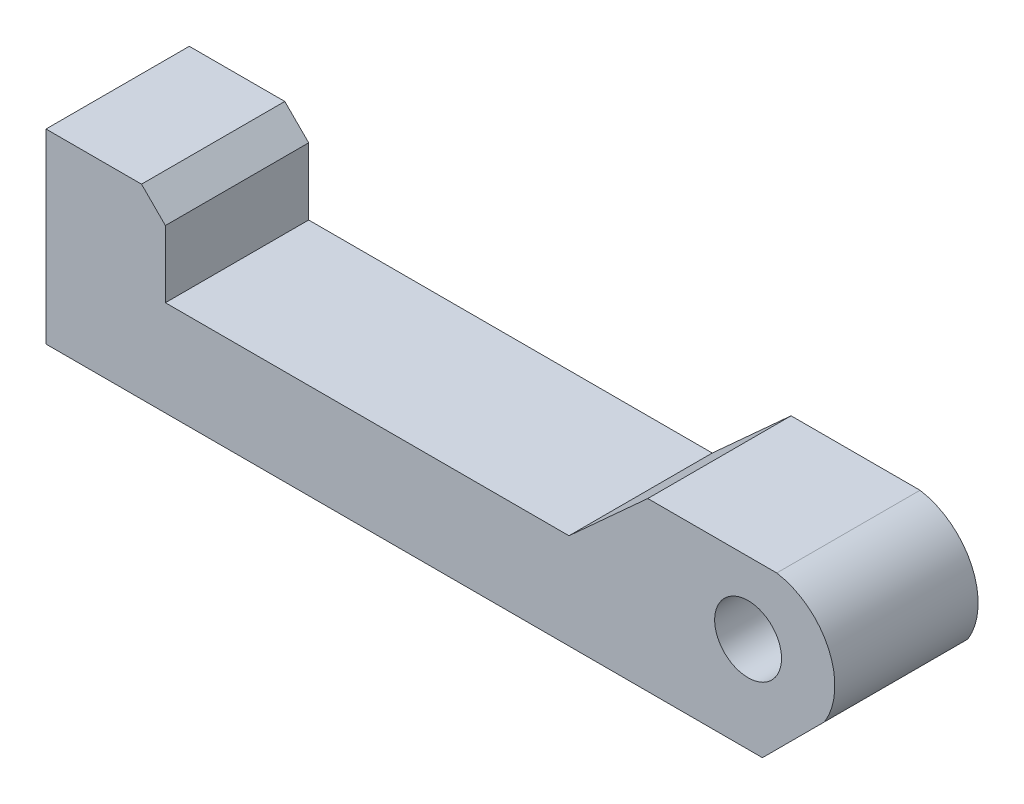
ISO-10303-21;
HEADER;
FILE_DESCRIPTION(('STEP AP214'),'2;1');
FILE_NAME('part.step','',(''),(''),'','','');
FILE_SCHEMA(('AUTOMOTIVE_DESIGN { 1 0 10303 214 1 1 1 1 }'));
ENDSEC;
DATA;
#1=APPLICATION_CONTEXT('core data for automotive mechanical design processes');
#2=APPLICATION_PROTOCOL_DEFINITION('international standard','automotive_design',2000,#1);
#3=PRODUCT_CONTEXT('',#1,'mechanical');
#4=PRODUCT('Part','Part','',(#3));
#5=PRODUCT_RELATED_PRODUCT_CATEGORY('part','',(#4));
#6=PRODUCT_DEFINITION_FORMATION('','',#4);
#7=PRODUCT_DEFINITION_CONTEXT('part definition',#1,'design');
#8=PRODUCT_DEFINITION('design','',#6,#7);
#9=PRODUCT_DEFINITION_SHAPE('','',#8);
#10=(LENGTH_UNIT() NAMED_UNIT(*) SI_UNIT(.MILLI.,.METRE.));
#11=(NAMED_UNIT(*) PLANE_ANGLE_UNIT() SI_UNIT($,.RADIAN.));
#12=(NAMED_UNIT(*) SI_UNIT($,.STERADIAN.) SOLID_ANGLE_UNIT());
#13=UNCERTAINTY_MEASURE_WITH_UNIT(LENGTH_MEASURE(1.E-05),#10,'distance_accuracy_value','');
#14=(GEOMETRIC_REPRESENTATION_CONTEXT(3) GLOBAL_UNCERTAINTY_ASSIGNED_CONTEXT((#13)) GLOBAL_UNIT_ASSIGNED_CONTEXT((#10,
#11,#12)) REPRESENTATION_CONTEXT('',''));
#15=CARTESIAN_POINT('',(0.,0.,0.));
#16=DIRECTION('',(0.,0.,1.));
#17=DIRECTION('',(1.,0.,0.));
#18=AXIS2_PLACEMENT_3D('',#15,#16,#17);
#19=CARTESIAN_POINT('',(0.,2.,0.));
#20=DIRECTION('',(0.,-1.,0.));
#21=DIRECTION('',(0.,0.,-1.));
#22=AXIS2_PLACEMENT_3D('',#19,#20,#21);
#23=PLANE('',#22);
#24=DIRECTION('',(0.,0.,-1.));
#25=VECTOR('',#24,1.);
#26=CARTESIAN_POINT('',(-5.65,2.,1.5));
#27=LINE('',#26,#25);
#28=CARTESIAN_POINT('',(-5.65,2.,1.5));
#29=VERTEX_POINT('',#28);
#30=CARTESIAN_POINT('',(-5.65,2.,-1.5));
#31=VERTEX_POINT('',#30);
#32=EDGE_CURVE('E222',#29,#31,#27,.T.);
#33=ORIENTED_EDGE('',*,*,#32,.F.);
#34=DIRECTION('',(1.,0.,0.));
#35=VECTOR('',#34,1.);
#36=CARTESIAN_POINT('',(-8.15,2.,1.5));
#37=LINE('',#36,#35);
#38=CARTESIAN_POINT('',(2.8,2.,1.5));
#39=VERTEX_POINT('',#38);
#40=EDGE_CURVE('E179',#29,#39,#37,.T.);
#41=ORIENTED_EDGE('',*,*,#40,.T.);
#42=DIRECTION('',(0.,0.,1.));
#43=VECTOR('',#42,1.);
#44=CARTESIAN_POINT('',(2.8,2.,-3.72991031209778));
#45=LINE('',#44,#43);
#46=CARTESIAN_POINT('',(2.8,2.,-1.5));
#47=VERTEX_POINT('',#46);
#48=EDGE_CURVE('E158',#47,#39,#45,.T.);
#49=ORIENTED_EDGE('',*,*,#48,.F.);
#50=DIRECTION('',(-1.,0.,0.));
#51=VECTOR('',#50,1.);
#52=CARTESIAN_POINT('',(-8.15,2.,-1.5));
#53=LINE('',#52,#51);
#54=EDGE_CURVE('E176',#47,#31,#53,.T.);
#55=ORIENTED_EDGE('',*,*,#54,.T.);
#56=EDGE_LOOP('',(#33,#41,#49,#55));
#57=FACE_BOUND('',#56,.T.);
#58=ADVANCED_FACE('F39',(#57),#23,.F.);
#59=CARTESIAN_POINT('',(-8.15,2.,-1.5));
#60=DIRECTION('',(0.,0.,1.));
#61=DIRECTION('',(1.,0.,0.));
#62=AXIS2_PLACEMENT_3D('',#59,#60,#61);
#63=PLANE('',#62);
#64=CARTESIAN_POINT('',(6.90991581729342,2.06359809876974,-1.5));
#65=DIRECTION('',(0.,0.,-1.));
#66=DIRECTION('',(1.,0.,0.));
#67=AXIS2_PLACEMENT_3D('',#64,#65,#66);
#68=CIRCLE('',#67,1.45632786028552);
#69=CARTESIAN_POINT('',(7.15,3.5,-1.5));
#70=VERTEX_POINT('',#69);
#71=CARTESIAN_POINT('',(8.15,1.3,-1.5));
#72=VERTEX_POINT('',#71);
#73=EDGE_CURVE('E120',#70,#72,#68,.T.);
#74=ORIENTED_EDGE('',*,*,#73,.T.);
#75=DIRECTION('',(0.707106781186548,0.707106781186548,0.));
#76=VECTOR('',#75,1.);
#77=CARTESIAN_POINT('',(6.85,0.,-1.5));
#78=LINE('',#77,#76);
#79=CARTESIAN_POINT('',(6.85,0.,-1.5));
#80=VERTEX_POINT('',#79);
#81=EDGE_CURVE('E133',#80,#72,#78,.T.);
#82=ORIENTED_EDGE('',*,*,#81,.F.);
#83=DIRECTION('',(-1.,0.,0.));
#84=VECTOR('',#83,1.);
#85=CARTESIAN_POINT('',(-8.15,0.,-1.5));
#86=LINE('',#85,#84);
#87=CARTESIAN_POINT('',(-8.15,0.,-1.5));
#88=VERTEX_POINT('',#87);
#89=EDGE_CURVE('E175',#80,#88,#86,.T.);
#90=ORIENTED_EDGE('',*,*,#89,.T.);
#91=DIRECTION('',(0.,-1.,0.));
#92=VECTOR('',#91,1.);
#93=CARTESIAN_POINT('',(-8.15,2.,-1.5));
#94=LINE('',#93,#92);
#95=CARTESIAN_POINT('',(-8.15,3.9,-1.5));
#96=VERTEX_POINT('',#95);
#97=EDGE_CURVE('E48',#96,#88,#94,.T.);
#98=ORIENTED_EDGE('',*,*,#97,.F.);
#99=DIRECTION('',(-1.,0.,0.));
#100=VECTOR('',#99,1.);
#101=CARTESIAN_POINT('',(-8.15,3.9,-1.5));
#102=LINE('',#101,#100);
#103=CARTESIAN_POINT('',(-6.15,3.9,-1.5));
#104=VERTEX_POINT('',#103);
#105=EDGE_CURVE('E218',#104,#96,#102,.T.);
#106=ORIENTED_EDGE('',*,*,#105,.F.);
#107=DIRECTION('',(0.707106781186548,-0.707106781186547,0.));
#108=VECTOR('',#107,1.);
#109=CARTESIAN_POINT('',(-5.65,3.4,-1.5));
#110=LINE('',#109,#108);
#111=CARTESIAN_POINT('',(-5.65,3.4,-1.5));
#112=VERTEX_POINT('',#111);
#113=EDGE_CURVE('E55',#104,#112,#110,.T.);
#114=ORIENTED_EDGE('',*,*,#113,.T.);
#115=DIRECTION('',(0.,-1.,0.));
#116=VECTOR('',#115,1.);
#117=CARTESIAN_POINT('',(-5.65,3.9,-1.5));
#118=LINE('',#117,#116);
#119=EDGE_CURVE('E62',#112,#31,#118,.T.);
#120=ORIENTED_EDGE('',*,*,#119,.T.);
#121=ORIENTED_EDGE('',*,*,#54,.F.);
#122=DIRECTION('',(0.739940073395944,0.672672793996313,0.));
#123=VECTOR('',#122,1.);
#124=CARTESIAN_POINT('',(4.45,3.5,-1.5));
#125=LINE('',#124,#123);
#126=CARTESIAN_POINT('',(4.45,3.5,-1.5));
#127=VERTEX_POINT('',#126);
#128=EDGE_CURVE('E162',#47,#127,#125,.T.);
#129=ORIENTED_EDGE('',*,*,#128,.T.);
#130=DIRECTION('',(-1.,0.,0.));
#131=VECTOR('',#130,1.);
#132=CARTESIAN_POINT('',(7.35,3.5,-1.5));
#133=LINE('',#132,#131);
#134=EDGE_CURVE('E136',#70,#127,#133,.T.);
#135=ORIENTED_EDGE('',*,*,#134,.F.);
#136=EDGE_LOOP('',(#74,#82,#90,#98,#106,#114,#120,#121,#129,#135));
#137=FACE_BOUND('',#136,.T.);
#138=CARTESIAN_POINT('',(6.55,2.,-1.5));
#139=DIRECTION('',(0.,0.,1.));
#140=DIRECTION('',(1.,0.,0.));
#141=AXIS2_PLACEMENT_3D('',#138,#139,#140);
#142=CIRCLE('',#141,0.699999999999999);
#143=CARTESIAN_POINT('',(7.25,2.,-1.5));
#144=VERTEX_POINT('',#143);
#145=EDGE_CURVE('E147',#144,#144,#142,.T.);
#146=ORIENTED_EDGE('',*,*,#145,.T.);
#147=EDGE_LOOP('',(#146));
#148=FACE_BOUND('',#147,.T.);
#149=ADVANCED_FACE('F41',(#137,#148),#63,.F.);
#150=CARTESIAN_POINT('',(-8.15,2.,1.5));
#151=DIRECTION('',(1.,0.,0.));
#152=DIRECTION('',(0.,0.,-1.));
#153=AXIS2_PLACEMENT_3D('',#150,#151,#152);
#154=PLANE('',#153);
#155=DIRECTION('',(0.,0.,1.));
#156=VECTOR('',#155,1.);
#157=CARTESIAN_POINT('',(-8.15,0.,1.5));
#158=LINE('',#157,#156);
#159=CARTESIAN_POINT('',(-8.15,0.,1.5));
#160=VERTEX_POINT('',#159);
#161=EDGE_CURVE('E186',#88,#160,#158,.T.);
#162=ORIENTED_EDGE('',*,*,#161,.T.);
#163=DIRECTION('',(0.,-1.,0.));
#164=VECTOR('',#163,1.);
#165=CARTESIAN_POINT('',(-8.15,2.,1.5));
#166=LINE('',#165,#164);
#167=CARTESIAN_POINT('',(-8.15,3.9,1.5));
#168=VERTEX_POINT('',#167);
#169=EDGE_CURVE('E183',#168,#160,#166,.T.);
#170=ORIENTED_EDGE('',*,*,#169,.F.);
#171=DIRECTION('',(0.,0.,1.));
#172=VECTOR('',#171,1.);
#173=CARTESIAN_POINT('',(-8.15,3.9,1.5));
#174=LINE('',#173,#172);
#175=EDGE_CURVE('E202',#96,#168,#174,.T.);
#176=ORIENTED_EDGE('',*,*,#175,.F.);
#177=ORIENTED_EDGE('',*,*,#97,.T.);
#178=EDGE_LOOP('',(#162,#170,#176,#177));
#179=FACE_BOUND('',#178,.T.);
#180=ADVANCED_FACE('F200',(#179),#154,.F.);
#181=CARTESIAN_POINT('',(-8.15,2.,1.5));
#182=DIRECTION('',(0.,0.,-1.));
#183=DIRECTION('',(-1.,0.,0.));
#184=AXIS2_PLACEMENT_3D('',#181,#182,#183);
#185=PLANE('',#184);
#186=DIRECTION('',(-0.707106781186547,-0.707106781186547,0.));
#187=VECTOR('',#186,1.);
#188=CARTESIAN_POINT('',(6.85,0.,1.5));
#189=LINE('',#188,#187);
#190=CARTESIAN_POINT('',(8.15,1.3,1.5));
#191=VERTEX_POINT('',#190);
#192=CARTESIAN_POINT('',(6.85,0.,1.5));
#193=VERTEX_POINT('',#192);
#194=EDGE_CURVE('E128',#191,#193,#189,.T.);
#195=ORIENTED_EDGE('',*,*,#194,.F.);
#196=CARTESIAN_POINT('',(6.90991581729342,2.06359809876974,1.5));
#197=DIRECTION('',(0.,0.,-1.));
#198=DIRECTION('',(-1.,0.,0.));
#199=AXIS2_PLACEMENT_3D('',#196,#197,#198);
#200=CIRCLE('',#199,1.45632786028552);
#201=CARTESIAN_POINT('',(7.15,3.5,1.5));
#202=VERTEX_POINT('',#201);
#203=EDGE_CURVE('E122',#191,#202,#200,.F.);
#204=ORIENTED_EDGE('',*,*,#203,.T.);
#205=DIRECTION('',(1.,0.,0.));
#206=VECTOR('',#205,1.);
#207=CARTESIAN_POINT('',(7.35,3.5,1.5));
#208=LINE('',#207,#206);
#209=CARTESIAN_POINT('',(4.45,3.5,1.5));
#210=VERTEX_POINT('',#209);
#211=EDGE_CURVE('E171',#210,#202,#208,.T.);
#212=ORIENTED_EDGE('',*,*,#211,.F.);
#213=DIRECTION('',(-0.739940073395944,-0.672672793996313,0.));
#214=VECTOR('',#213,1.);
#215=CARTESIAN_POINT('',(4.45,3.5,1.5));
#216=LINE('',#215,#214);
#217=EDGE_CURVE('E154',#210,#39,#216,.T.);
#218=ORIENTED_EDGE('',*,*,#217,.T.);
#219=ORIENTED_EDGE('',*,*,#40,.F.);
#220=DIRECTION('',(0.,-1.,0.));
#221=VECTOR('',#220,1.);
#222=CARTESIAN_POINT('',(-5.65,3.9,1.5));
#223=LINE('',#222,#221);
#224=CARTESIAN_POINT('',(-5.65,3.4,1.5));
#225=VERTEX_POINT('',#224);
#226=EDGE_CURVE('E236',#225,#29,#223,.T.);
#227=ORIENTED_EDGE('',*,*,#226,.F.);
#228=DIRECTION('',(0.707106781186548,-0.707106781186547,0.));
#229=VECTOR('',#228,1.);
#230=CARTESIAN_POINT('',(-5.65,3.4,1.5));
#231=LINE('',#230,#229);
#232=CARTESIAN_POINT('',(-6.15,3.9,1.5));
#233=VERTEX_POINT('',#232);
#234=EDGE_CURVE('E215',#233,#225,#231,.T.);
#235=ORIENTED_EDGE('',*,*,#234,.F.);
#236=DIRECTION('',(1.,0.,0.));
#237=VECTOR('',#236,1.);
#238=CARTESIAN_POINT('',(-8.15,3.9,1.5));
#239=LINE('',#238,#237);
#240=EDGE_CURVE('E213',#168,#233,#239,.T.);
#241=ORIENTED_EDGE('',*,*,#240,.F.);
#242=ORIENTED_EDGE('',*,*,#169,.T.);
#243=DIRECTION('',(1.,0.,0.));
#244=VECTOR('',#243,1.);
#245=CARTESIAN_POINT('',(-8.15,0.,1.5));
#246=LINE('',#245,#244);
#247=EDGE_CURVE('E180',#160,#193,#246,.T.);
#248=ORIENTED_EDGE('',*,*,#247,.T.);
#249=EDGE_LOOP('',(#195,#204,#212,#218,#219,#227,#235,#241,#242,#248));
#250=FACE_BOUND('',#249,.T.);
#251=CARTESIAN_POINT('',(6.55,2.,1.5));
#252=DIRECTION('',(0.,0.,1.));
#253=DIRECTION('',(1.,0.,0.));
#254=AXIS2_PLACEMENT_3D('',#251,#252,#253);
#255=CIRCLE('',#254,0.699999999999999);
#256=CARTESIAN_POINT('',(7.25,2.,1.5));
#257=VERTEX_POINT('',#256);
#258=EDGE_CURVE('E142',#257,#257,#255,.T.);
#259=ORIENTED_EDGE('',*,*,#258,.F.);
#260=EDGE_LOOP('',(#259));
#261=FACE_BOUND('',#260,.T.);
#262=ADVANCED_FACE('F208',(#250,#261),#185,.F.);
#263=CARTESIAN_POINT('',(0.,0.,0.));
#264=DIRECTION('',(0.,-1.,0.));
#265=DIRECTION('',(0.,0.,-1.));
#266=AXIS2_PLACEMENT_3D('',#263,#264,#265);
#267=PLANE('',#266);
#268=DIRECTION('',(0.,0.,1.));
#269=VECTOR('',#268,1.);
#270=CARTESIAN_POINT('',(6.85,0.,-3.33847763108502));
#271=LINE('',#270,#269);
#272=EDGE_CURVE('E127',#80,#193,#271,.T.);
#273=ORIENTED_EDGE('',*,*,#272,.T.);
#274=ORIENTED_EDGE('',*,*,#247,.F.);
#275=ORIENTED_EDGE('',*,*,#161,.F.);
#276=ORIENTED_EDGE('',*,*,#89,.F.);
#277=EDGE_LOOP('',(#273,#274,#275,#276));
#278=FACE_BOUND('',#277,.T.);
#279=ADVANCED_FACE('F206',(#278),#267,.T.);
#280=CARTESIAN_POINT('',(0.,3.5,0.));
#281=DIRECTION('',(0.,-1.,0.));
#282=DIRECTION('',(0.,0.,-1.));
#283=AXIS2_PLACEMENT_3D('',#280,#281,#282);
#284=PLANE('',#283);
#285=ORIENTED_EDGE('',*,*,#211,.T.);
#286=DIRECTION('',(0.,0.,-1.));
#287=VECTOR('',#286,1.);
#288=CARTESIAN_POINT('',(7.15,3.5,0.));
#289=LINE('',#288,#287);
#290=EDGE_CURVE('E11',#202,#70,#289,.T.);
#291=ORIENTED_EDGE('',*,*,#290,.T.);
#292=ORIENTED_EDGE('',*,*,#134,.T.);
#293=DIRECTION('',(0.,0.,1.));
#294=VECTOR('',#293,1.);
#295=CARTESIAN_POINT('',(4.45,3.5,-1.5));
#296=LINE('',#295,#294);
#297=EDGE_CURVE('E167',#127,#210,#296,.T.);
#298=ORIENTED_EDGE('',*,*,#297,.T.);
#299=EDGE_LOOP('',(#285,#291,#292,#298));
#300=FACE_BOUND('',#299,.T.);
#301=ADVANCED_FACE('F252',(#300),#284,.F.);
#302=CARTESIAN_POINT('',(4.45,3.5,-3.72991031209778));
#303=DIRECTION('',(-0.672672793996313,0.739940073395944,0.));
#304=DIRECTION('',(-0.739940073395944,-0.672672793996313,0.));
#305=AXIS2_PLACEMENT_3D('',#302,#303,#304);
#306=PLANE('',#305);
#307=ORIENTED_EDGE('',*,*,#128,.F.);
#308=ORIENTED_EDGE('',*,*,#48,.T.);
#309=ORIENTED_EDGE('',*,*,#217,.F.);
#310=ORIENTED_EDGE('',*,*,#297,.F.);
#311=EDGE_LOOP('',(#307,#308,#309,#310));
#312=FACE_BOUND('',#311,.T.);
#313=ADVANCED_FACE('F250',(#312),#306,.T.);
#314=CARTESIAN_POINT('',(6.55,2.,1.5));
#315=DIRECTION('',(0.,0.,1.));
#316=DIRECTION('',(1.,0.,0.));
#317=AXIS2_PLACEMENT_3D('',#314,#315,#316);
#318=CYLINDRICAL_SURFACE('',#317,0.699999999999999);
#319=ORIENTED_EDGE('',*,*,#145,.F.);
#320=EDGE_LOOP('',(#319));
#321=FACE_BOUND('',#320,.T.);
#322=ORIENTED_EDGE('',*,*,#258,.T.);
#323=EDGE_LOOP('',(#322));
#324=FACE_BOUND('',#323,.T.);
#325=ADVANCED_FACE('F308',(#321,#324),#318,.F.);
#326=CARTESIAN_POINT('',(6.85,0.,-3.33847763108502));
#327=DIRECTION('',(-0.707106781186548,0.707106781186548,0.));
#328=DIRECTION('',(-0.707106781186548,-0.707106781186548,0.));
#329=AXIS2_PLACEMENT_3D('',#326,#327,#328);
#330=PLANE('',#329);
#331=ORIENTED_EDGE('',*,*,#81,.T.);
#332=DIRECTION('',(0.,0.,1.));
#333=VECTOR('',#332,1.);
#334=CARTESIAN_POINT('',(8.15,1.3,-3.33847763108502));
#335=LINE('',#334,#333);
#336=EDGE_CURVE('E117',#72,#191,#335,.T.);
#337=ORIENTED_EDGE('',*,*,#336,.T.);
#338=ORIENTED_EDGE('',*,*,#194,.T.);
#339=ORIENTED_EDGE('',*,*,#272,.F.);
#340=EDGE_LOOP('',(#331,#337,#338,#339));
#341=FACE_BOUND('',#340,.T.);
#342=ADVANCED_FACE('F139',(#341),#330,.F.);
#343=CARTESIAN_POINT('',(-5.65,3.9,1.5));
#344=DIRECTION('',(-1.,0.,0.));
#345=DIRECTION('',(0.,0.,1.));
#346=AXIS2_PLACEMENT_3D('',#343,#344,#345);
#347=PLANE('',#346);
#348=ORIENTED_EDGE('',*,*,#119,.F.);
#349=DIRECTION('',(0.,0.,1.));
#350=VECTOR('',#349,1.);
#351=CARTESIAN_POINT('',(-5.65,3.4,-1.5));
#352=LINE('',#351,#350);
#353=EDGE_CURVE('E226',#112,#225,#352,.T.);
#354=ORIENTED_EDGE('',*,*,#353,.T.);
#355=ORIENTED_EDGE('',*,*,#226,.T.);
#356=ORIENTED_EDGE('',*,*,#32,.T.);
#357=EDGE_LOOP('',(#348,#354,#355,#356));
#358=FACE_BOUND('',#357,.T.);
#359=ADVANCED_FACE('F243',(#358),#347,.F.);
#360=CARTESIAN_POINT('',(0.,3.9,0.));
#361=DIRECTION('',(0.,-1.,0.));
#362=DIRECTION('',(0.,0.,-1.));
#363=AXIS2_PLACEMENT_3D('',#360,#361,#362);
#364=PLANE('',#363);
#365=ORIENTED_EDGE('',*,*,#240,.T.);
#366=DIRECTION('',(0.,0.,1.));
#367=VECTOR('',#366,1.);
#368=CARTESIAN_POINT('',(-6.15,3.9,-1.5));
#369=LINE('',#368,#367);
#370=EDGE_CURVE('E229',#104,#233,#369,.T.);
#371=ORIENTED_EDGE('',*,*,#370,.F.);
#372=ORIENTED_EDGE('',*,*,#105,.T.);
#373=ORIENTED_EDGE('',*,*,#175,.T.);
#374=EDGE_LOOP('',(#365,#371,#372,#373));
#375=FACE_BOUND('',#374,.T.);
#376=ADVANCED_FACE('F220',(#375),#364,.F.);
#377=CARTESIAN_POINT('',(-5.65,3.4,-1.5));
#378=DIRECTION('',(-0.707106781186547,-0.707106781186548,0.));
#379=DIRECTION('',(0.707106781186548,-0.707106781186547,0.));
#380=AXIS2_PLACEMENT_3D('',#377,#378,#379);
#381=PLANE('',#380);
#382=ORIENTED_EDGE('',*,*,#234,.T.);
#383=ORIENTED_EDGE('',*,*,#353,.F.);
#384=ORIENTED_EDGE('',*,*,#113,.F.);
#385=ORIENTED_EDGE('',*,*,#370,.T.);
#386=EDGE_LOOP('',(#382,#383,#384,#385));
#387=FACE_BOUND('',#386,.T.);
#388=ADVANCED_FACE('F261',(#387),#381,.F.);
#389=CARTESIAN_POINT('',(6.90991581729342,2.06359809876974,4.0138115846759));
#390=DIRECTION('',(0.,0.,-1.));
#391=DIRECTION('',(-1.,0.,0.));
#392=AXIS2_PLACEMENT_3D('',#389,#390,#391);
#393=CYLINDRICAL_SURFACE('',#392,1.45632786028552);
#394=ORIENTED_EDGE('',*,*,#203,.F.);
#395=ORIENTED_EDGE('',*,*,#336,.F.);
#396=ORIENTED_EDGE('',*,*,#73,.F.);
#397=ORIENTED_EDGE('',*,*,#290,.F.);
#398=EDGE_LOOP('',(#394,#395,#396,#397));
#399=FACE_BOUND('',#398,.T.);
#400=ADVANCED_FACE('F119',(#399),#393,.T.);
#401=CLOSED_SHELL('',(#58,#149,#180,#262,#279,#301,#313,#325,#342,#359,#376,#388,#400));
#402=MANIFOLD_SOLID_BREP('B2',#401);
#403=ADVANCED_BREP_SHAPE_REPRESENTATION('',(#18,#402),#14);
#404=SHAPE_DEFINITION_REPRESENTATION(#9,#403);
ENDSEC;
END-ISO-10303-21;
